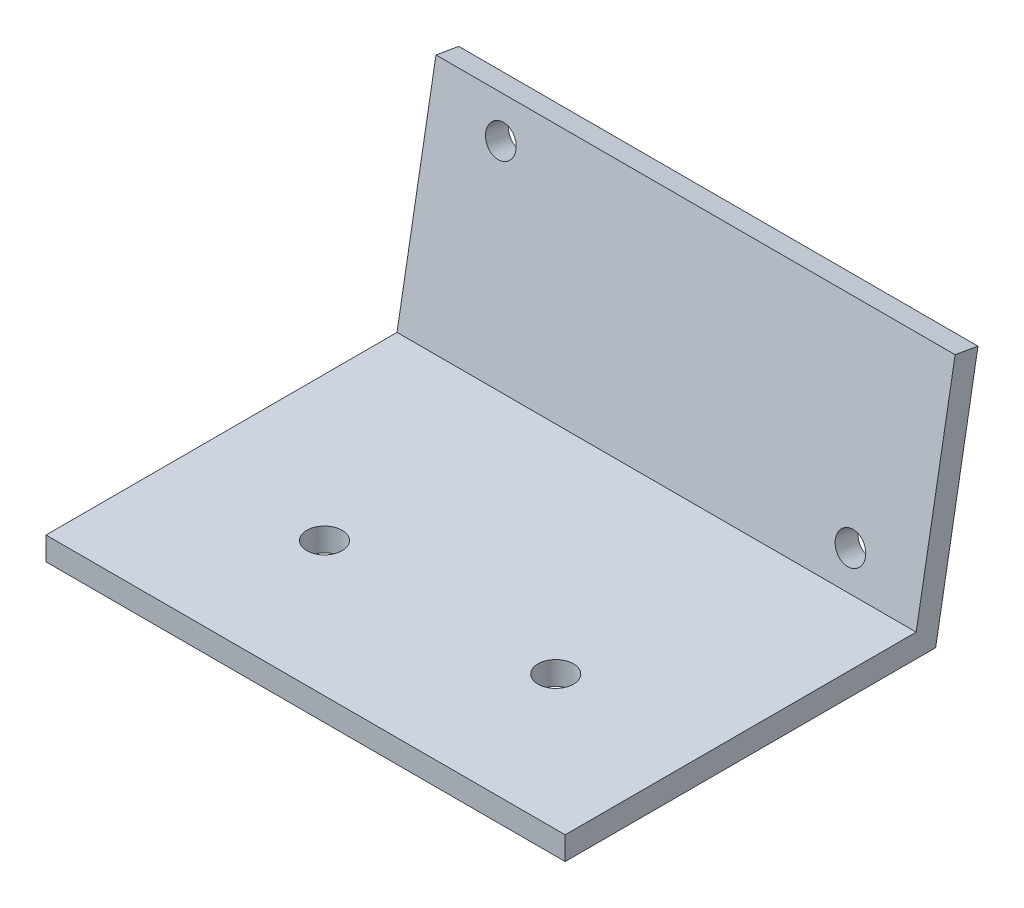
ISO-10303-21;
HEADER;
FILE_DESCRIPTION(('STEP AP214'),'2;1');
FILE_NAME('part.step','',(''),(''),'','','');
FILE_SCHEMA(('AUTOMOTIVE_DESIGN { 1 0 10303 214 1 1 1 1 }'));
ENDSEC;
DATA;
#1=APPLICATION_CONTEXT('core data for automotive mechanical design processes');
#2=APPLICATION_PROTOCOL_DEFINITION('international standard','automotive_design',2000,#1);
#3=PRODUCT_CONTEXT('',#1,'mechanical');
#4=PRODUCT('Part','Part','',(#3));
#5=PRODUCT_RELATED_PRODUCT_CATEGORY('part','',(#4));
#6=PRODUCT_DEFINITION_FORMATION('','',#4);
#7=PRODUCT_DEFINITION_CONTEXT('part definition',#1,'design');
#8=PRODUCT_DEFINITION('design','',#6,#7);
#9=PRODUCT_DEFINITION_SHAPE('','',#8);
#10=(LENGTH_UNIT() NAMED_UNIT(*) SI_UNIT(.MILLI.,.METRE.));
#11=(NAMED_UNIT(*) PLANE_ANGLE_UNIT() SI_UNIT($,.RADIAN.));
#12=(NAMED_UNIT(*) SI_UNIT($,.STERADIAN.) SOLID_ANGLE_UNIT());
#13=UNCERTAINTY_MEASURE_WITH_UNIT(LENGTH_MEASURE(1.E-05),#10,'distance_accuracy_value','');
#14=(GEOMETRIC_REPRESENTATION_CONTEXT(3) GLOBAL_UNCERTAINTY_ASSIGNED_CONTEXT((#13)) GLOBAL_UNIT_ASSIGNED_CONTEXT((#10,
#11,#12)) REPRESENTATION_CONTEXT('',''));
#15=CARTESIAN_POINT('',(0.,0.,0.));
#16=DIRECTION('',(0.,0.,1.));
#17=DIRECTION('',(1.,0.,0.));
#18=AXIS2_PLACEMENT_3D('',#15,#16,#17);
#19=CARTESIAN_POINT('',(-55.88,-0.661158353315185,32.8410137392312));
#20=DIRECTION('',(0.,-1.,0.));
#21=DIRECTION('',(0.,0.,-1.));
#22=AXIS2_PLACEMENT_3D('',#19,#20,#21);
#23=PLANE('',#22);
#24=CARTESIAN_POINT('',(-15.494,-0.661158353315164,58.2410137392312));
#25=DIRECTION('',(0.,-1.,0.));
#26=DIRECTION('',(0.,0.,-1.));
#27=AXIS2_PLACEMENT_3D('',#24,#25,#26);
#28=CIRCLE('',#27,1.905);
#29=CARTESIAN_POINT('',(-15.494,-0.661158353315166,56.3360137392312));
#30=VERTEX_POINT('',#29);
#31=EDGE_CURVE('E185',#30,#30,#28,.T.);
#32=ORIENTED_EDGE('',*,*,#31,.F.);
#33=EDGE_LOOP('',(#32));
#34=FACE_BOUND('',#33,.T.);
#35=CARTESIAN_POINT('',(-40.386,-0.661158353315164,58.2410137392312));
#36=DIRECTION('',(0.,-1.,0.));
#37=DIRECTION('',(0.,0.,-1.));
#38=AXIS2_PLACEMENT_3D('',#35,#36,#37);
#39=CIRCLE('',#38,1.905);
#40=CARTESIAN_POINT('',(-40.386,-0.661158353315166,56.3360137392312));
#41=VERTEX_POINT('',#40);
#42=EDGE_CURVE('E122',#41,#41,#39,.T.);
#43=ORIENTED_EDGE('',*,*,#42,.F.);
#44=EDGE_LOOP('',(#43));
#45=FACE_BOUND('',#44,.T.);
#46=DIRECTION('',(0.,0.,-1.));
#47=VECTOR('',#46,1.);
#48=CARTESIAN_POINT('',(0.,-0.661158353315185,32.8410137392312));
#49=LINE('',#48,#47);
#50=CARTESIAN_POINT('',(0.,-0.661158353315148,72.7190137392312));
#51=VERTEX_POINT('',#50);
#52=CARTESIAN_POINT('',(0.,-0.661158353315185,32.8410137392312));
#53=VERTEX_POINT('',#52);
#54=EDGE_CURVE('E118',#51,#53,#49,.T.);
#55=ORIENTED_EDGE('',*,*,#54,.F.);
#56=DIRECTION('',(1.,0.,0.));
#57=VECTOR('',#56,1.);
#58=CARTESIAN_POINT('',(-55.88,-0.661158353315148,72.7190137392312));
#59=LINE('',#58,#57);
#60=CARTESIAN_POINT('',(-55.88,-0.661158353315148,72.7190137392312));
#61=VERTEX_POINT('',#60);
#62=EDGE_CURVE('E11',#61,#51,#59,.T.);
#63=ORIENTED_EDGE('',*,*,#62,.F.);
#64=DIRECTION('',(0.,0.,-1.));
#65=VECTOR('',#64,1.);
#66=CARTESIAN_POINT('',(-55.88,-0.661158353315185,32.8410137392312));
#67=LINE('',#66,#65);
#68=CARTESIAN_POINT('',(-55.88,-0.661158353315185,32.8410137392312));
#69=VERTEX_POINT('',#68);
#70=EDGE_CURVE('E133',#61,#69,#67,.T.);
#71=ORIENTED_EDGE('',*,*,#70,.T.);
#72=DIRECTION('',(1.,0.,0.));
#73=VECTOR('',#72,1.);
#74=CARTESIAN_POINT('',(-55.88,-0.661158353315185,32.8410137392312));
#75=LINE('',#74,#73);
#76=EDGE_CURVE('E36',#69,#53,#75,.T.);
#77=ORIENTED_EDGE('',*,*,#76,.T.);
#78=EDGE_LOOP('',(#55,#63,#71,#77));
#79=FACE_BOUND('',#78,.T.);
#80=ADVANCED_FACE('F33',(#34,#45,#79),#23,.T.);
#81=CARTESIAN_POINT('',(-55.88,-0.661158353315148,72.7190137392312));
#82=DIRECTION('',(0.,0.,1.));
#83=DIRECTION('',(0.,-1.,0.));
#84=AXIS2_PLACEMENT_3D('',#81,#82,#83);
#85=PLANE('',#84);
#86=DIRECTION('',(0.,-1.,0.));
#87=VECTOR('',#86,1.);
#88=CARTESIAN_POINT('',(0.,-0.661158353315148,72.7190137392312));
#89=LINE('',#88,#87);
#90=CARTESIAN_POINT('',(0.,1.83884164668485,72.7190137392312));
#91=VERTEX_POINT('',#90);
#92=EDGE_CURVE('E131',#91,#51,#89,.T.);
#93=ORIENTED_EDGE('',*,*,#92,.F.);
#94=DIRECTION('',(1.,0.,0.));
#95=VECTOR('',#94,1.);
#96=CARTESIAN_POINT('',(-55.88,1.83884164668485,72.7190137392312));
#97=LINE('',#96,#95);
#98=CARTESIAN_POINT('',(-55.88,1.83884164668485,72.7190137392312));
#99=VERTEX_POINT('',#98);
#100=EDGE_CURVE('E42',#99,#91,#97,.T.);
#101=ORIENTED_EDGE('',*,*,#100,.F.);
#102=DIRECTION('',(0.,-1.,0.));
#103=VECTOR('',#102,1.);
#104=CARTESIAN_POINT('',(-55.88,-0.661158353315148,72.7190137392312));
#105=LINE('',#104,#103);
#106=EDGE_CURVE('E108',#99,#61,#105,.T.);
#107=ORIENTED_EDGE('',*,*,#106,.T.);
#108=ORIENTED_EDGE('',*,*,#62,.T.);
#109=EDGE_LOOP('',(#93,#101,#107,#108));
#110=FACE_BOUND('',#109,.T.);
#111=ADVANCED_FACE('F141',(#110),#85,.T.);
#112=CARTESIAN_POINT('',(-55.88,1.83884164668485,72.7190137392312));
#113=DIRECTION('',(0.,1.,0.));
#114=DIRECTION('',(0.,0.,1.));
#115=AXIS2_PLACEMENT_3D('',#112,#113,#114);
#116=PLANE('',#115);
#117=CARTESIAN_POINT('',(-15.494,1.83884164668477,58.2410137392312));
#118=DIRECTION('',(0.,1.,0.));
#119=DIRECTION('',(0.,0.,1.));
#120=AXIS2_PLACEMENT_3D('',#117,#118,#119);
#121=CIRCLE('',#120,1.905);
#122=CARTESIAN_POINT('',(-15.494,1.83884164668477,60.1460137392312));
#123=VERTEX_POINT('',#122);
#124=EDGE_CURVE('E177',#123,#123,#121,.T.);
#125=ORIENTED_EDGE('',*,*,#124,.F.);
#126=EDGE_LOOP('',(#125));
#127=FACE_BOUND('',#126,.T.);
#128=CARTESIAN_POINT('',(-40.386,1.83884164668477,58.2410137392312));
#129=DIRECTION('',(0.,1.,0.));
#130=DIRECTION('',(0.,0.,1.));
#131=AXIS2_PLACEMENT_3D('',#128,#129,#130);
#132=CIRCLE('',#131,1.905);
#133=CARTESIAN_POINT('',(-40.386,1.83884164668477,60.1460137392312));
#134=VERTEX_POINT('',#133);
#135=EDGE_CURVE('E188',#134,#134,#132,.T.);
#136=ORIENTED_EDGE('',*,*,#135,.F.);
#137=EDGE_LOOP('',(#136));
#138=FACE_BOUND('',#137,.T.);
#139=DIRECTION('',(0.,0.,1.));
#140=VECTOR('',#139,1.);
#141=CARTESIAN_POINT('',(0.,1.83884164668485,72.7190137392312));
#142=LINE('',#141,#140);
#143=CARTESIAN_POINT('',(0.,1.83884164668481,34.9387628171744));
#144=VERTEX_POINT('',#143);
#145=EDGE_CURVE('E95',#144,#91,#142,.T.);
#146=ORIENTED_EDGE('',*,*,#145,.F.);
#147=DIRECTION('',(1.,0.,0.));
#148=VECTOR('',#147,1.);
#149=CARTESIAN_POINT('',(-55.88,1.83884164668481,34.9387628171744));
#150=LINE('',#149,#148);
#151=CARTESIAN_POINT('',(-55.88,1.83884164668481,34.9387628171744));
#152=VERTEX_POINT('',#151);
#153=EDGE_CURVE('E90',#152,#144,#150,.T.);
#154=ORIENTED_EDGE('',*,*,#153,.F.);
#155=DIRECTION('',(0.,0.,1.));
#156=VECTOR('',#155,1.);
#157=CARTESIAN_POINT('',(-55.88,1.83884164668485,72.7190137392312));
#158=LINE('',#157,#156);
#159=EDGE_CURVE('E93',#152,#99,#158,.T.);
#160=ORIENTED_EDGE('',*,*,#159,.T.);
#161=ORIENTED_EDGE('',*,*,#100,.T.);
#162=EDGE_LOOP('',(#146,#154,#160,#161));
#163=FACE_BOUND('',#162,.T.);
#164=ADVANCED_FACE('F92',(#127,#138,#163),#116,.T.);
#165=CARTESIAN_POINT('',(-55.88,1.83884164668481,34.9387628171744));
#166=DIRECTION('',(0.,0.173648177666927,0.984807753012209));
#167=DIRECTION('',(0.,-0.984807753012209,0.173648177666927));
#168=AXIS2_PLACEMENT_3D('',#165,#166,#167);
#169=PLANE('',#168);
#170=CARTESIAN_POINT('',(-7.7216,5.49191522293668,34.294627383168));
#171=DIRECTION('',(0.,0.173648177666927,0.984807753012209));
#172=DIRECTION('',(0.,-0.984807753012209,0.173648177666927));
#173=AXIS2_PLACEMENT_3D('',#170,#171,#172);
#174=CIRCLE('',#173,1.6256);
#175=CARTESIAN_POINT('',(-7.7216,7.09281870623333,34.0123449055527));
#176=VERTEX_POINT('',#175);
#177=EDGE_CURVE('E174',#176,#176,#174,.F.);
#178=ORIENTED_EDGE('',*,*,#177,.T.);
#179=EDGE_LOOP('',(#178));
#180=FACE_BOUND('',#179,.T.);
#181=CARTESIAN_POINT('',(-48.2149052791429,21.7510912251682,31.4276959698871));
#182=DIRECTION('',(0.,0.173648177666927,0.984807753012209));
#183=DIRECTION('',(0.,-0.984807753012209,0.173648177666927));
#184=AXIS2_PLACEMENT_3D('',#181,#182,#183);
#185=CIRCLE('',#184,1.6256);
#186=CARTESIAN_POINT('',(-48.2149052791429,23.3519947084649,31.1454134922717));
#187=VERTEX_POINT('',#186);
#188=EDGE_CURVE('E173',#187,#187,#185,.F.);
#189=ORIENTED_EDGE('',*,*,#188,.T.);
#190=EDGE_LOOP('',(#189));
#191=FACE_BOUND('',#190,.T.);
#192=DIRECTION('',(0.,-0.984807753012209,0.173648177666927));
#193=VECTOR('',#192,1.);
#194=CARTESIAN_POINT('',(0.,1.83884164668481,34.9387628171744));
#195=LINE('',#194,#193);
#196=CARTESIAN_POINT('',(0.,25.6022527268694,30.7486322900715));
#197=VERTEX_POINT('',#196);
#198=EDGE_CURVE('E128',#197,#144,#195,.T.);
#199=ORIENTED_EDGE('',*,*,#198,.F.);
#200=DIRECTION('',(1.,0.,0.));
#201=VECTOR('',#200,1.);
#202=CARTESIAN_POINT('',(-55.88,25.6022527268694,30.7486322900715));
#203=LINE('',#202,#201);
#204=CARTESIAN_POINT('',(-55.88,25.6022527268694,30.7486322900715));
#205=VERTEX_POINT('',#204);
#206=EDGE_CURVE('E100',#205,#197,#203,.T.);
#207=ORIENTED_EDGE('',*,*,#206,.F.);
#208=DIRECTION('',(0.,-0.984807753012209,0.173648177666927));
#209=VECTOR('',#208,1.);
#210=CARTESIAN_POINT('',(-55.88,1.83884164668481,34.9387628171744));
#211=LINE('',#210,#209);
#212=EDGE_CURVE('E106',#205,#152,#211,.T.);
#213=ORIENTED_EDGE('',*,*,#212,.T.);
#214=ORIENTED_EDGE('',*,*,#153,.T.);
#215=EDGE_LOOP('',(#199,#207,#213,#214));
#216=FACE_BOUND('',#215,.T.);
#217=ADVANCED_FACE('F110',(#180,#191,#216),#169,.T.);
#218=CARTESIAN_POINT('',(-55.88,25.6022527268694,30.7486322900715));
#219=DIRECTION('',(0.,0.984807753012209,-0.173648177666926));
#220=DIRECTION('',(0.,0.173648177666926,0.984807753012209));
#221=AXIS2_PLACEMENT_3D('',#218,#219,#220);
#222=PLANE('',#221);
#223=DIRECTION('',(0.,0.173648177666926,0.984807753012209));
#224=VECTOR('',#223,1.);
#225=CARTESIAN_POINT('',(0.,25.6022527268694,30.7486322900715));
#226=LINE('',#225,#224);
#227=CARTESIAN_POINT('',(0.,25.1681322827021,28.2866129075409));
#228=VERTEX_POINT('',#227);
#229=EDGE_CURVE('E125',#228,#197,#226,.T.);
#230=ORIENTED_EDGE('',*,*,#229,.F.);
#231=DIRECTION('',(1.,0.,0.));
#232=VECTOR('',#231,1.);
#233=CARTESIAN_POINT('',(-55.88,25.1681322827021,28.2866129075409));
#234=LINE('',#233,#232);
#235=CARTESIAN_POINT('',(-55.88,25.1681322827021,28.2866129075409));
#236=VERTEX_POINT('',#235);
#237=EDGE_CURVE('E136',#236,#228,#234,.T.);
#238=ORIENTED_EDGE('',*,*,#237,.F.);
#239=DIRECTION('',(0.,0.173648177666926,0.984807753012209));
#240=VECTOR('',#239,1.);
#241=CARTESIAN_POINT('',(-55.88,25.6022527268694,30.7486322900715));
#242=LINE('',#241,#240);
#243=EDGE_CURVE('E111',#236,#205,#242,.T.);
#244=ORIENTED_EDGE('',*,*,#243,.T.);
#245=ORIENTED_EDGE('',*,*,#206,.T.);
#246=EDGE_LOOP('',(#230,#238,#244,#245));
#247=FACE_BOUND('',#246,.T.);
#248=ADVANCED_FACE('F156',(#247),#222,.T.);
#249=CARTESIAN_POINT('',(-55.88,25.1681322827021,28.2866129075409));
#250=DIRECTION('',(0.,-0.173648177666926,-0.984807753012209));
#251=DIRECTION('',(0.,0.984807753012209,-0.173648177666926));
#252=AXIS2_PLACEMENT_3D('',#249,#250,#251);
#253=PLANE('',#252);
#254=CARTESIAN_POINT('',(-7.7216,5.05779477876936,31.8326080006375));
#255=DIRECTION('',(0.,-0.173648177666926,-0.984807753012209));
#256=DIRECTION('',(0.,0.984807753012209,-0.173648177666926));
#257=AXIS2_PLACEMENT_3D('',#254,#255,#256);
#258=CIRCLE('',#257,1.6256);
#259=CARTESIAN_POINT('',(-7.7216,6.65869826206601,31.5503255230222));
#260=VERTEX_POINT('',#259);
#261=EDGE_CURVE('E168',#260,#260,#258,.T.);
#262=ORIENTED_EDGE('',*,*,#261,.F.);
#263=EDGE_LOOP('',(#262));
#264=FACE_BOUND('',#263,.T.);
#265=CARTESIAN_POINT('',(-48.2149052791429,21.3169707810009,28.9656765873566));
#266=DIRECTION('',(0.,-0.173648177666926,-0.984807753012209));
#267=DIRECTION('',(0.,0.984807753012209,-0.173648177666926));
#268=AXIS2_PLACEMENT_3D('',#265,#266,#267);
#269=CIRCLE('',#268,1.6256);
#270=CARTESIAN_POINT('',(-48.2149052791429,22.9178742642976,28.6833941097412));
#271=VERTEX_POINT('',#270);
#272=EDGE_CURVE('E171',#271,#271,#269,.T.);
#273=ORIENTED_EDGE('',*,*,#272,.F.);
#274=EDGE_LOOP('',(#273));
#275=FACE_BOUND('',#274,.T.);
#276=DIRECTION('',(0.,0.984807753012209,-0.173648177666926));
#277=VECTOR('',#276,1.);
#278=CARTESIAN_POINT('',(0.,25.1681322827021,28.2866129075409));
#279=LINE('',#278,#277);
#280=EDGE_CURVE('E121',#53,#228,#279,.T.);
#281=ORIENTED_EDGE('',*,*,#280,.F.);
#282=ORIENTED_EDGE('',*,*,#76,.F.);
#283=DIRECTION('',(0.,0.984807753012209,-0.173648177666926));
#284=VECTOR('',#283,1.);
#285=CARTESIAN_POINT('',(-55.88,25.1681322827021,28.2866129075409));
#286=LINE('',#285,#284);
#287=EDGE_CURVE('E113',#69,#236,#286,.T.);
#288=ORIENTED_EDGE('',*,*,#287,.T.);
#289=ORIENTED_EDGE('',*,*,#237,.T.);
#290=EDGE_LOOP('',(#281,#282,#288,#289));
#291=FACE_BOUND('',#290,.T.);
#292=ADVANCED_FACE('F138',(#264,#275,#291),#253,.T.);
#293=CARTESIAN_POINT('',(-55.88,0.,0.));
#294=DIRECTION('',(-1.,0.,0.));
#295=DIRECTION('',(0.,0.,1.));
#296=AXIS2_PLACEMENT_3D('',#293,#294,#295);
#297=PLANE('',#296);
#298=ORIENTED_EDGE('',*,*,#70,.F.);
#299=ORIENTED_EDGE('',*,*,#106,.F.);
#300=ORIENTED_EDGE('',*,*,#159,.F.);
#301=ORIENTED_EDGE('',*,*,#212,.F.);
#302=ORIENTED_EDGE('',*,*,#243,.F.);
#303=ORIENTED_EDGE('',*,*,#287,.F.);
#304=EDGE_LOOP('',(#298,#299,#300,#301,#302,#303));
#305=FACE_BOUND('',#304,.T.);
#306=ADVANCED_FACE('F104',(#305),#297,.T.);
#307=CARTESIAN_POINT('',(0.,0.,0.));
#308=DIRECTION('',(-1.,0.,0.));
#309=DIRECTION('',(0.,0.,1.));
#310=AXIS2_PLACEMENT_3D('',#307,#308,#309);
#311=PLANE('',#310);
#312=ORIENTED_EDGE('',*,*,#54,.T.);
#313=ORIENTED_EDGE('',*,*,#280,.T.);
#314=ORIENTED_EDGE('',*,*,#229,.T.);
#315=ORIENTED_EDGE('',*,*,#198,.T.);
#316=ORIENTED_EDGE('',*,*,#145,.T.);
#317=ORIENTED_EDGE('',*,*,#92,.T.);
#318=EDGE_LOOP('',(#312,#313,#314,#315,#316,#317));
#319=FACE_BOUND('',#318,.T.);
#320=ADVANCED_FACE('F140',(#319),#311,.F.);
#321=CARTESIAN_POINT('',(-40.386,-40.5791583533152,58.2410137392312));
#322=DIRECTION('',(0.,1.,0.));
#323=DIRECTION('',(0.,0.,1.));
#324=AXIS2_PLACEMENT_3D('',#321,#322,#323);
#325=CYLINDRICAL_SURFACE('',#324,1.905);
#326=ORIENTED_EDGE('',*,*,#42,.T.);
#327=EDGE_LOOP('',(#326));
#328=FACE_BOUND('',#327,.T.);
#329=ORIENTED_EDGE('',*,*,#135,.T.);
#330=EDGE_LOOP('',(#329));
#331=FACE_BOUND('',#330,.T.);
#332=ADVANCED_FACE('F195',(#328,#331),#325,.F.);
#333=CARTESIAN_POINT('',(-15.494,-40.5791583533152,58.2410137392312));
#334=DIRECTION('',(0.,1.,0.));
#335=DIRECTION('',(0.,0.,1.));
#336=AXIS2_PLACEMENT_3D('',#333,#334,#335);
#337=CYLINDRICAL_SURFACE('',#336,1.905);
#338=ORIENTED_EDGE('',*,*,#31,.T.);
#339=EDGE_LOOP('',(#338));
#340=FACE_BOUND('',#339,.T.);
#341=ORIENTED_EDGE('',*,*,#124,.T.);
#342=EDGE_LOOP('',(#341));
#343=FACE_BOUND('',#342,.T.);
#344=ADVANCED_FACE('F199',(#340,#343),#337,.F.);
#345=CARTESIAN_POINT('',(-48.2149052791429,22.5495066416961,35.955734806144));
#346=DIRECTION('',(0.,-0.173648177666926,-0.984807753012209));
#347=DIRECTION('',(0.,0.984807753012209,-0.173648177666926));
#348=AXIS2_PLACEMENT_3D('',#345,#346,#347);
#349=CYLINDRICAL_SURFACE('',#348,1.6256);
#350=CARTESIAN_POINT('',(-48.2149052791429,22.9178742642976,28.6833941097412));
#351=CARTESIAN_POINT('',(-48.2149052791429,22.9223963522576,28.7090401449759));
#352=CARTESIAN_POINT('',(-48.2149052791429,22.9269184402177,28.7346861802106));
#353=CARTESIAN_POINT('',(-48.2149052791429,22.9359626161379,28.78597825068));
#354=CARTESIAN_POINT('',(-48.2149052791429,22.940484704098,28.8116242859147));
#355=CARTESIAN_POINT('',(-48.2149052791429,22.9495288800181,28.8629163563841));
#356=CARTESIAN_POINT('',(-48.2149052791429,22.9540509679782,28.8885623916188));
#357=CARTESIAN_POINT('',(-48.2149052791429,22.9630951438983,28.9398544620881));
#358=CARTESIAN_POINT('',(-48.2149052791429,22.9676172318584,28.9655004973228));
#359=CARTESIAN_POINT('',(-48.2149052791429,22.9766614077786,29.0167925677922));
#360=CARTESIAN_POINT('',(-48.2149052791429,22.9811834957386,29.0424386030269));
#361=CARTESIAN_POINT('',(-48.2149052791429,22.9902276716588,29.0937306734963));
#362=CARTESIAN_POINT('',(-48.2149052791429,22.9947497596189,29.119376708731));
#363=CARTESIAN_POINT('',(-48.2149052791429,23.003793935539,29.1706687792004));
#364=CARTESIAN_POINT('',(-48.2149052791429,23.0083160234991,29.1963148144351));
#365=CARTESIAN_POINT('',(-48.2149052791429,23.0173601994193,29.2476068849045));
#366=CARTESIAN_POINT('',(-48.2149052791429,23.0218822873793,29.2732529201392));
#367=CARTESIAN_POINT('',(-48.2149052791429,23.0309264632995,29.3245449906085));
#368=CARTESIAN_POINT('',(-48.2149052791429,23.0354485512596,29.3501910258432));
#369=CARTESIAN_POINT('',(-48.2149052791429,23.0444927271797,29.4014830963126));
#370=CARTESIAN_POINT('',(-48.2149052791429,23.0490148151398,29.4271291315473));
#371=CARTESIAN_POINT('',(-48.2149052791429,23.0580589910599,29.4784212020167));
#372=CARTESIAN_POINT('',(-48.2149052791429,23.06258107902,29.5040672372514));
#373=CARTESIAN_POINT('',(-48.2149052791429,23.0716252549402,29.5553593077208));
#374=CARTESIAN_POINT('',(-48.2149052791429,23.0761473429002,29.5810053429555));
#375=CARTESIAN_POINT('',(-48.2149052791429,23.0851915188204,29.6322974134249));
#376=CARTESIAN_POINT('',(-48.2149052791429,23.0897136067805,29.6579434486595));
#377=CARTESIAN_POINT('',(-48.2149052791429,23.0987577827006,29.7092355191289));
#378=CARTESIAN_POINT('',(-48.2149052791429,23.1032798706607,29.7348815543636));
#379=CARTESIAN_POINT('',(-48.2149052791429,23.1123240465808,29.786173624833));
#380=CARTESIAN_POINT('',(-48.2149052791429,23.1168461345409,29.8118196600677));
#381=CARTESIAN_POINT('',(-48.2149052791429,23.1258903104611,29.8631117305371));
#382=CARTESIAN_POINT('',(-48.2149052791429,23.1304123984212,29.8887577657718));
#383=CARTESIAN_POINT('',(-48.2149052791429,23.1394565743413,29.9400498362412));
#384=CARTESIAN_POINT('',(-48.2149052791429,23.1439786623014,29.9656958714759));
#385=CARTESIAN_POINT('',(-48.2149052791429,23.1530228382215,30.0169879419452));
#386=CARTESIAN_POINT('',(-48.2149052791429,23.1575449261816,30.0426339771799));
#387=CARTESIAN_POINT('',(-48.2149052791429,23.1665891021018,30.0939260476493));
#388=CARTESIAN_POINT('',(-48.2149052791429,23.1711111900618,30.119572082884));
#389=CARTESIAN_POINT('',(-48.2149052791429,23.180155365982,30.1708641533534));
#390=CARTESIAN_POINT('',(-48.2149052791429,23.1846774539421,30.1965101885881));
#391=CARTESIAN_POINT('',(-48.2149052791429,23.1937216298622,30.2478022590575));
#392=CARTESIAN_POINT('',(-48.2149052791429,23.1982437178223,30.2734482942922));
#393=CARTESIAN_POINT('',(-48.2149052791429,23.2072878937425,30.3247403647616));
#394=CARTESIAN_POINT('',(-48.2149052791429,23.2118099817025,30.3503863999962));
#395=CARTESIAN_POINT('',(-48.2149052791429,23.2208541576227,30.4016784704656));
#396=CARTESIAN_POINT('',(-48.2149052791429,23.2253762455828,30.4273245057003));
#397=CARTESIAN_POINT('',(-48.2149052791429,23.2344204215029,30.4786165761697));
#398=CARTESIAN_POINT('',(-48.2149052791429,23.238942509463,30.5042626114044));
#399=CARTESIAN_POINT('',(-48.2149052791429,23.2479866853831,30.5555546818738));
#400=CARTESIAN_POINT('',(-48.2149052791429,23.2525087733432,30.5812007171085));
#401=CARTESIAN_POINT('',(-48.2149052791429,23.2615529492634,30.6324927875779));
#402=CARTESIAN_POINT('',(-48.2149052791429,23.2660750372234,30.6581388228126));
#403=CARTESIAN_POINT('',(-48.2149052791429,23.2751192131436,30.709430893282));
#404=CARTESIAN_POINT('',(-48.2149052791429,23.2796413011037,30.7350769285166));
#405=CARTESIAN_POINT('',(-48.2149052791429,23.2886854770238,30.786368998986));
#406=CARTESIAN_POINT('',(-48.2149052791429,23.2932075649839,30.8120150342207));
#407=CARTESIAN_POINT('',(-48.2149052791429,23.3022517409041,30.8633071046901));
#408=CARTESIAN_POINT('',(-48.2149052791429,23.3067738288641,30.8889531399248));
#409=CARTESIAN_POINT('',(-48.2149052791429,23.3158180047843,30.9402452103942));
#410=CARTESIAN_POINT('',(-48.2149052791429,23.3203400927444,30.9658912456289));
#411=CARTESIAN_POINT('',(-48.2149052791429,23.3293842686645,31.0171833160983));
#412=CARTESIAN_POINT('',(-48.2149052791429,23.3339063566246,31.042829351333));
#413=CARTESIAN_POINT('',(-48.2149052791429,23.3429505325447,31.0941214218023));
#414=CARTESIAN_POINT('',(-48.2149052791429,23.3474726205048,31.119767457037));
#415=CARTESIAN_POINT('',(-48.2149052791429,23.3519947084649,31.1454134922717));
#416=B_SPLINE_CURVE_WITH_KNOTS('',3,(#350,#351,#352,#353,#354,#355,#356,#357,#358,#359,#360,
#361,#362,#363,#364,#365,#366,#367,#368,#369,#370,#371,#372,#373,#374,#375,#376,#377,#378,#379,
#380,#381,#382,#383,#384,#385,#386,#387,#388,#389,#390,#391,#392,#393,#394,#395,#396,#397,#398,
#399,#400,#401,#402,#403,#404,#405,#406,#407,#408,#409,#410,#411,#412,#413,#414,#415),
.UNSPECIFIED.,.F.,.F.,(4,2,2,2,2,2,2,2,2,2,2,2,2,2,2,2,2,2,2,2,2,2,2,2,2,2,2,2,2,2,2,2,4),(0.,
0.0781250000000009,0.156249999999998,0.234374999999999,0.3125,0.390624999999996,
0.468749999999997,0.546874999999998,0.624999999999998,0.703124999999999,0.781249999999997,
0.859374999999997,0.937499999999998,1.015625,1.09375,1.171875,1.25,1.328125,1.40625,1.484375,
1.5625,1.640625,1.71875,1.796875,1.875,1.953125,2.03124999999999,2.109375,2.1875,2.265625,
2.34375,2.42187499999999,2.5),.UNSPECIFIED.);
#417=EDGE_CURVE('BSEAM207',#271,#187,#416,.T.);
#418=ORIENTED_EDGE('',*,*,#272,.T.);
#419=ORIENTED_EDGE('',*,*,#188,.F.);
#420=ORIENTED_EDGE('',*,*,#417,.T.);
#421=ORIENTED_EDGE('',*,*,#417,.F.);
#422=EDGE_LOOP('',(#418,#420,#419,#421));
#423=FACE_BOUND('',#422,.T.);
#424=ADVANCED_FACE('F207',(#423),#349,.F.);
#425=CARTESIAN_POINT('',(-7.7216,6.29033063946451,38.8226662194249));
#426=DIRECTION('',(0.,-0.173648177666926,-0.984807753012209));
#427=DIRECTION('',(0.,0.984807753012209,-0.173648177666926));
#428=AXIS2_PLACEMENT_3D('',#425,#426,#427);
#429=CYLINDRICAL_SURFACE('',#428,1.6256);
#430=CARTESIAN_POINT('',(-7.7216,6.65869826206601,31.5503255230222));
#431=CARTESIAN_POINT('',(-7.7216,6.66322035002608,31.5759715582569));
#432=CARTESIAN_POINT('',(-7.7216,6.66774243798616,31.6016175934916));
#433=CARTESIAN_POINT('',(-7.7216,6.67678661390631,31.6529096639609));
#434=CARTESIAN_POINT('',(-7.7216,6.68130870186639,31.6785556991956));
#435=CARTESIAN_POINT('',(-7.7216,6.69035287778654,31.729847769665));
#436=CARTESIAN_POINT('',(-7.7216,6.69487496574662,31.7554938048997));
#437=CARTESIAN_POINT('',(-7.7216,6.70391914166677,31.8067858753691));
#438=CARTESIAN_POINT('',(-7.7216,6.70844122962685,31.8324319106038));
#439=CARTESIAN_POINT('',(-7.7216,6.717485405547,31.8837239810732));
#440=CARTESIAN_POINT('',(-7.7216,6.72200749350708,31.9093700163079));
#441=CARTESIAN_POINT('',(-7.7216,6.73105166942723,31.9606620867773));
#442=CARTESIAN_POINT('',(-7.7216,6.7355737573873,31.9863081220119));
#443=CARTESIAN_POINT('',(-7.7216,6.74461793330746,32.0376001924813));
#444=CARTESIAN_POINT('',(-7.7216,6.74914002126753,32.063246227716));
#445=CARTESIAN_POINT('',(-7.7216,6.75818419718769,32.1145382981854));
#446=CARTESIAN_POINT('',(-7.7216,6.76270628514776,32.1401843334201));
#447=CARTESIAN_POINT('',(-7.7216,6.77175046106791,32.1914764038895));
#448=CARTESIAN_POINT('',(-7.7216,6.77627254902799,32.2171224391242));
#449=CARTESIAN_POINT('',(-7.7216,6.78531672494814,32.2684145095936));
#450=CARTESIAN_POINT('',(-7.7216,6.78983881290822,32.2940605448283));
#451=CARTESIAN_POINT('',(-7.7216,6.79888298882837,32.3453526152977));
#452=CARTESIAN_POINT('',(-7.7216,6.80340507678845,32.3709986505323));
#453=CARTESIAN_POINT('',(-7.7216,6.8124492527086,32.4222907210017));
#454=CARTESIAN_POINT('',(-7.7216,6.81697134066868,32.4479367562364));
#455=CARTESIAN_POINT('',(-7.7216,6.82601551658883,32.4992288267058));
#456=CARTESIAN_POINT('',(-7.7216,6.8305376045489,32.5248748619405));
#457=CARTESIAN_POINT('',(-7.7216,6.83958178046906,32.5761669324099));
#458=CARTESIAN_POINT('',(-7.7216,6.84410386842913,32.6018129676446));
#459=CARTESIAN_POINT('',(-7.7216,6.85314804434929,32.653105038114));
#460=CARTESIAN_POINT('',(-7.7216,6.85767013230936,32.6787510733486));
#461=CARTESIAN_POINT('',(-7.7216,6.86671430822951,32.730043143818));
#462=CARTESIAN_POINT('',(-7.7216,6.87123639618959,32.7556891790527));
#463=CARTESIAN_POINT('',(-7.7216,6.88028057210974,32.8069812495221));
#464=CARTESIAN_POINT('',(-7.7216,6.88480266006982,32.8326272847568));
#465=CARTESIAN_POINT('',(-7.7216,6.89384683598997,32.8839193552262));
#466=CARTESIAN_POINT('',(-7.7216,6.89836892395005,32.9095653904609));
#467=CARTESIAN_POINT('',(-7.7216,6.9074130998702,32.9608574609303));
#468=CARTESIAN_POINT('',(-7.7216,6.91193518783028,32.986503496165));
#469=CARTESIAN_POINT('',(-7.7216,6.92097936375043,33.0377955666344));
#470=CARTESIAN_POINT('',(-7.7216,6.92550145171051,33.0634416018691));
#471=CARTESIAN_POINT('',(-7.7216,6.93454562763066,33.1147336723384));
#472=CARTESIAN_POINT('',(-7.7216,6.93906771559073,33.1403797075731));
#473=CARTESIAN_POINT('',(-7.7216,6.94811189151089,33.1916717780425));
#474=CARTESIAN_POINT('',(-7.7216,6.95263397947096,33.2173178132772));
#475=CARTESIAN_POINT('',(-7.7216,6.96167815539112,33.2686098837466));
#476=CARTESIAN_POINT('',(-7.7216,6.96620024335119,33.2942559189813));
#477=CARTESIAN_POINT('',(-7.7216,6.97524441927134,33.3455479894507));
#478=CARTESIAN_POINT('',(-7.7216,6.97976650723142,33.3711940246854));
#479=CARTESIAN_POINT('',(-7.7216,6.98881068315157,33.4224860951548));
#480=CARTESIAN_POINT('',(-7.7216,6.99333277111165,33.4481321303894));
#481=CARTESIAN_POINT('',(-7.7216,7.0023769470318,33.4994242008588));
#482=CARTESIAN_POINT('',(-7.7216,7.00689903499188,33.5250702360935));
#483=CARTESIAN_POINT('',(-7.7216,7.01594321091203,33.5763623065629));
#484=CARTESIAN_POINT('',(-7.7216,7.02046529887211,33.6020083417976));
#485=CARTESIAN_POINT('',(-7.7216,7.02950947479226,33.653300412267));
#486=CARTESIAN_POINT('',(-7.7216,7.03403156275234,33.6789464475017));
#487=CARTESIAN_POINT('',(-7.7216,7.04307573867249,33.7302385179711));
#488=CARTESIAN_POINT('',(-7.7216,7.04759782663256,33.7558845532058));
#489=CARTESIAN_POINT('',(-7.7216,7.05664200255272,33.8071766236751));
#490=CARTESIAN_POINT('',(-7.7216,7.06116409051279,33.8328226589098));
#491=CARTESIAN_POINT('',(-7.7216,7.07020826643294,33.8841147293792));
#492=CARTESIAN_POINT('',(-7.7216,7.07473035439302,33.9097607646139));
#493=CARTESIAN_POINT('',(-7.7216,7.08377453031317,33.9610528350833));
#494=CARTESIAN_POINT('',(-7.7216,7.08829661827325,33.986698870318));
#495=CARTESIAN_POINT('',(-7.7216,7.09281870623333,34.0123449055527));
#496=B_SPLINE_CURVE_WITH_KNOTS('',3,(#430,#431,#432,#433,#434,#435,#436,#437,#438,#439,#440,
#441,#442,#443,#444,#445,#446,#447,#448,#449,#450,#451,#452,#453,#454,#455,#456,#457,#458,#459,
#460,#461,#462,#463,#464,#465,#466,#467,#468,#469,#470,#471,#472,#473,#474,#475,#476,#477,#478,
#479,#480,#481,#482,#483,#484,#485,#486,#487,#488,#489,#490,#491,#492,#493,#494,#495),
.UNSPECIFIED.,.F.,.F.,(4,2,2,2,2,2,2,2,2,2,2,2,2,2,2,2,2,2,2,2,2,2,2,2,2,2,2,2,2,2,2,2,4),(0.,
0.0781250000000042,0.156250000000001,0.234375000000006,0.312500000000003,0.390625,
0.468750000000004,0.546875000000002,0.625000000000006,0.703125000000003,0.781250000000007,
0.859375000000004,0.937500000000002,1.01562500000001,1.09375,1.171875,1.25,1.328125,
1.40625000000001,1.484375,1.56250000000001,1.640625,1.71875,1.79687500000001,1.875,
1.95312500000001,2.03125,2.10937500000001,2.18750000000001,2.265625,2.34375000000001,2.421875,
2.50000000000001),.UNSPECIFIED.);
#497=EDGE_CURVE('BSEAM213',#260,#176,#496,.T.);
#498=ORIENTED_EDGE('',*,*,#261,.T.);
#499=ORIENTED_EDGE('',*,*,#177,.F.);
#500=ORIENTED_EDGE('',*,*,#497,.T.);
#501=ORIENTED_EDGE('',*,*,#497,.F.);
#502=EDGE_LOOP('',(#498,#500,#499,#501));
#503=FACE_BOUND('',#502,.T.);
#504=ADVANCED_FACE('F213',(#503),#429,.F.);
#505=CLOSED_SHELL('',(#80,#111,#164,#217,#248,#292,#306,#320,#332,#344,#424,#504));
#506=MANIFOLD_SOLID_BREP('B2',#505);
#507=ADVANCED_BREP_SHAPE_REPRESENTATION('',(#18,#506),#14);
#508=SHAPE_DEFINITION_REPRESENTATION(#9,#507);
ENDSEC;
END-ISO-10303-21;
